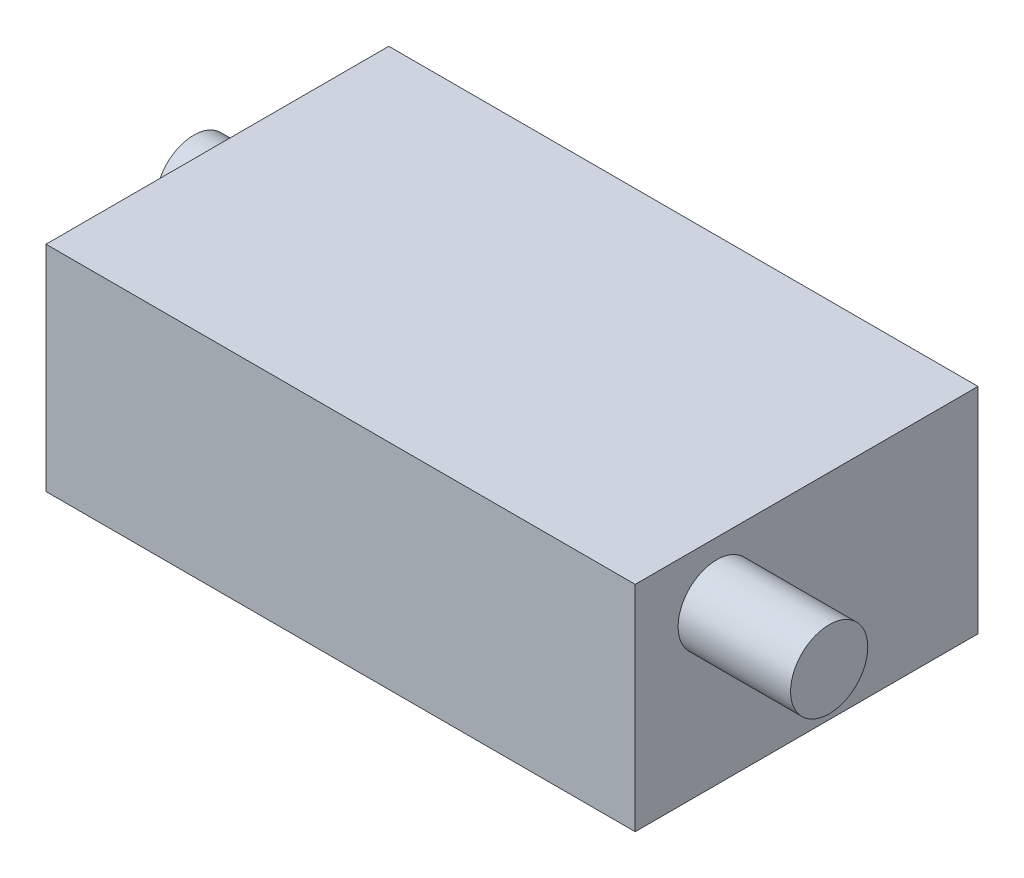
ISO-10303-21;
HEADER;
FILE_DESCRIPTION(('STEP AP214'),'2;1');
FILE_NAME('part.step','',(''),(''),'','','');
FILE_SCHEMA(('AUTOMOTIVE_DESIGN { 1 0 10303 214 1 1 1 1 }'));
ENDSEC;
DATA;
#1=APPLICATION_CONTEXT('core data for automotive mechanical design processes');
#2=APPLICATION_PROTOCOL_DEFINITION('international standard','automotive_design',2000,#1);
#3=PRODUCT_CONTEXT('',#1,'mechanical');
#4=PRODUCT('Part','Part','',(#3));
#5=PRODUCT_RELATED_PRODUCT_CATEGORY('part','',(#4));
#6=PRODUCT_DEFINITION_FORMATION('','',#4);
#7=PRODUCT_DEFINITION_CONTEXT('part definition',#1,'design');
#8=PRODUCT_DEFINITION('design','',#6,#7);
#9=PRODUCT_DEFINITION_SHAPE('','',#8);
#10=(LENGTH_UNIT() NAMED_UNIT(*) SI_UNIT(.MILLI.,.METRE.));
#11=(NAMED_UNIT(*) PLANE_ANGLE_UNIT() SI_UNIT($,.RADIAN.));
#12=(NAMED_UNIT(*) SI_UNIT($,.STERADIAN.) SOLID_ANGLE_UNIT());
#13=UNCERTAINTY_MEASURE_WITH_UNIT(LENGTH_MEASURE(1.E-05),#10,'distance_accuracy_value','');
#14=(GEOMETRIC_REPRESENTATION_CONTEXT(3) GLOBAL_UNCERTAINTY_ASSIGNED_CONTEXT((#13)) GLOBAL_UNIT_ASSIGNED_CONTEXT((#10,
#11,#12)) REPRESENTATION_CONTEXT('',''));
#15=CARTESIAN_POINT('',(0.,0.,0.));
#16=DIRECTION('',(0.,0.,1.));
#17=DIRECTION('',(1.,0.,0.));
#18=AXIS2_PLACEMENT_3D('',#15,#16,#17);
#19=CARTESIAN_POINT('',(104.775,38.1,0.));
#20=DIRECTION('',(-1.,0.,0.));
#21=DIRECTION('',(0.,0.,1.));
#22=AXIS2_PLACEMENT_3D('',#19,#20,#21);
#23=PLANE('',#22);
#24=DIRECTION('',(0.,-1.,0.));
#25=VECTOR('',#24,1.);
#26=CARTESIAN_POINT('',(104.775,0.,0.));
#27=LINE('',#26,#25);
#28=CARTESIAN_POINT('',(104.775,38.1,0.));
#29=VERTEX_POINT('',#28);
#30=CARTESIAN_POINT('',(104.775,0.,0.));
#31=VERTEX_POINT('',#30);
#32=EDGE_CURVE('E85',#29,#31,#27,.T.);
#33=ORIENTED_EDGE('',*,*,#32,.T.);
#34=DIRECTION('',(0.,0.,-1.));
#35=VECTOR('',#34,1.);
#36=CARTESIAN_POINT('',(104.775,0.,0.));
#37=LINE('',#36,#35);
#38=CARTESIAN_POINT('',(104.775,0.,-60.96));
#39=VERTEX_POINT('',#38);
#40=EDGE_CURVE('E80',#31,#39,#37,.T.);
#41=ORIENTED_EDGE('',*,*,#40,.T.);
#42=DIRECTION('',(0.,1.,0.));
#43=VECTOR('',#42,1.);
#44=CARTESIAN_POINT('',(104.775,0.,-60.96));
#45=LINE('',#44,#43);
#46=CARTESIAN_POINT('',(104.775,38.1,-60.96));
#47=VERTEX_POINT('',#46);
#48=EDGE_CURVE('E83',#39,#47,#45,.T.);
#49=ORIENTED_EDGE('',*,*,#48,.T.);
#50=DIRECTION('',(0.,0.,1.));
#51=VECTOR('',#50,1.);
#52=CARTESIAN_POINT('',(104.775,38.1,0.));
#53=LINE('',#52,#51);
#54=EDGE_CURVE('E49',#47,#29,#53,.T.);
#55=ORIENTED_EDGE('',*,*,#54,.T.);
#56=EDGE_LOOP('',(#33,#41,#49,#55));
#57=FACE_BOUND('',#56,.T.);
#58=CARTESIAN_POINT('',(104.775,27.7788489813834,-14.4931277787205));
#59=DIRECTION('',(-1.,0.,0.));
#60=DIRECTION('',(0.,0.,1.));
#61=AXIS2_PLACEMENT_3D('',#58,#59,#60);
#62=CIRCLE('',#61,6.86542550240675);
#63=CARTESIAN_POINT('',(104.775,27.7788489813834,-7.62770227631372));
#64=VERTEX_POINT('',#63);
#65=EDGE_CURVE('E11',#64,#64,#62,.F.);
#66=ORIENTED_EDGE('',*,*,#65,.F.);
#67=EDGE_LOOP('',(#66));
#68=FACE_BOUND('',#67,.T.);
#69=ADVANCED_FACE('F32',(#57,#68),#23,.F.);
#70=CARTESIAN_POINT('',(0.,38.1,0.));
#71=DIRECTION('',(-1.,0.,0.));
#72=DIRECTION('',(0.,0.,1.));
#73=AXIS2_PLACEMENT_3D('',#70,#71,#72);
#74=PLANE('',#73);
#75=DIRECTION('',(0.,-1.,0.));
#76=VECTOR('',#75,1.);
#77=CARTESIAN_POINT('',(0.,0.,0.));
#78=LINE('',#77,#76);
#79=CARTESIAN_POINT('',(0.,38.1,0.));
#80=VERTEX_POINT('',#79);
#81=CARTESIAN_POINT('',(0.,0.,0.));
#82=VERTEX_POINT('',#81);
#83=EDGE_CURVE('E99',#80,#82,#78,.T.);
#84=ORIENTED_EDGE('',*,*,#83,.F.);
#85=DIRECTION('',(0.,0.,1.));
#86=VECTOR('',#85,1.);
#87=CARTESIAN_POINT('',(0.,38.1,0.));
#88=LINE('',#87,#86);
#89=CARTESIAN_POINT('',(0.,38.1,-60.96));
#90=VERTEX_POINT('',#89);
#91=EDGE_CURVE('E72',#90,#80,#88,.T.);
#92=ORIENTED_EDGE('',*,*,#91,.F.);
#93=DIRECTION('',(0.,1.,0.));
#94=VECTOR('',#93,1.);
#95=CARTESIAN_POINT('',(0.,0.,-60.96));
#96=LINE('',#95,#94);
#97=CARTESIAN_POINT('',(0.,0.,-60.96));
#98=VERTEX_POINT('',#97);
#99=EDGE_CURVE('E66',#98,#90,#96,.T.);
#100=ORIENTED_EDGE('',*,*,#99,.F.);
#101=DIRECTION('',(0.,0.,-1.));
#102=VECTOR('',#101,1.);
#103=CARTESIAN_POINT('',(0.,0.,0.));
#104=LINE('',#103,#102);
#105=EDGE_CURVE('E90',#82,#98,#104,.T.);
#106=ORIENTED_EDGE('',*,*,#105,.F.);
#107=EDGE_LOOP('',(#84,#92,#100,#106));
#108=FACE_BOUND('',#107,.T.);
#109=CARTESIAN_POINT('',(0.,15.0277031039288,-46.2809833457989));
#110=DIRECTION('',(-1.,0.,0.));
#111=DIRECTION('',(0.,0.,1.));
#112=AXIS2_PLACEMENT_3D('',#109,#110,#111);
#113=CIRCLE('',#112,6.73289792490981);
#114=CARTESIAN_POINT('',(0.,15.0277031039288,-39.5480854208891));
#115=VERTEX_POINT('',#114);
#116=EDGE_CURVE('E116',#115,#115,#113,.T.);
#117=ORIENTED_EDGE('',*,*,#116,.F.);
#118=EDGE_LOOP('',(#117));
#119=FACE_BOUND('',#118,.T.);
#120=ADVANCED_FACE('F110',(#108,#119),#74,.T.);
#121=CARTESIAN_POINT('',(104.775,0.,0.));
#122=DIRECTION('',(0.,0.,-1.));
#123=DIRECTION('',(-1.,0.,0.));
#124=AXIS2_PLACEMENT_3D('',#121,#122,#123);
#125=PLANE('',#124);
#126=ORIENTED_EDGE('',*,*,#83,.T.);
#127=DIRECTION('',(-1.,0.,0.));
#128=VECTOR('',#127,1.);
#129=CARTESIAN_POINT('',(104.775,0.,0.));
#130=LINE('',#129,#128);
#131=EDGE_CURVE('E41',#31,#82,#130,.T.);
#132=ORIENTED_EDGE('',*,*,#131,.F.);
#133=ORIENTED_EDGE('',*,*,#32,.F.);
#134=DIRECTION('',(-1.,0.,0.));
#135=VECTOR('',#134,1.);
#136=CARTESIAN_POINT('',(104.775,38.1,0.));
#137=LINE('',#136,#135);
#138=EDGE_CURVE('E95',#29,#80,#137,.T.);
#139=ORIENTED_EDGE('',*,*,#138,.T.);
#140=EDGE_LOOP('',(#126,#132,#133,#139));
#141=FACE_BOUND('',#140,.T.);
#142=ADVANCED_FACE('F34',(#141),#125,.F.);
#143=CARTESIAN_POINT('',(104.775,0.,0.));
#144=DIRECTION('',(0.,1.,0.));
#145=DIRECTION('',(0.,0.,1.));
#146=AXIS2_PLACEMENT_3D('',#143,#144,#145);
#147=PLANE('',#146);
#148=ORIENTED_EDGE('',*,*,#105,.T.);
#149=DIRECTION('',(-1.,0.,0.));
#150=VECTOR('',#149,1.);
#151=CARTESIAN_POINT('',(104.775,0.,-60.96));
#152=LINE('',#151,#150);
#153=EDGE_CURVE('E88',#39,#98,#152,.T.);
#154=ORIENTED_EDGE('',*,*,#153,.F.);
#155=ORIENTED_EDGE('',*,*,#40,.F.);
#156=ORIENTED_EDGE('',*,*,#131,.T.);
#157=EDGE_LOOP('',(#148,#154,#155,#156));
#158=FACE_BOUND('',#157,.T.);
#159=ADVANCED_FACE('F89',(#158),#147,.F.);
#160=CARTESIAN_POINT('',(104.775,0.,-60.96));
#161=DIRECTION('',(0.,0.,1.));
#162=DIRECTION('',(1.,0.,0.));
#163=AXIS2_PLACEMENT_3D('',#160,#161,#162);
#164=PLANE('',#163);
#165=ORIENTED_EDGE('',*,*,#99,.T.);
#166=DIRECTION('',(-1.,0.,0.));
#167=VECTOR('',#166,1.);
#168=CARTESIAN_POINT('',(104.775,38.1,-60.96));
#169=LINE('',#168,#167);
#170=EDGE_CURVE('E91',#47,#90,#169,.T.);
#171=ORIENTED_EDGE('',*,*,#170,.F.);
#172=ORIENTED_EDGE('',*,*,#48,.F.);
#173=ORIENTED_EDGE('',*,*,#153,.T.);
#174=EDGE_LOOP('',(#165,#171,#172,#173));
#175=FACE_BOUND('',#174,.T.);
#176=ADVANCED_FACE('F93',(#175),#164,.F.);
#177=CARTESIAN_POINT('',(104.775,38.1,0.));
#178=DIRECTION('',(0.,-1.,0.));
#179=DIRECTION('',(0.,0.,-1.));
#180=AXIS2_PLACEMENT_3D('',#177,#178,#179);
#181=PLANE('',#180);
#182=ORIENTED_EDGE('',*,*,#91,.T.);
#183=ORIENTED_EDGE('',*,*,#138,.F.);
#184=ORIENTED_EDGE('',*,*,#54,.F.);
#185=ORIENTED_EDGE('',*,*,#170,.T.);
#186=EDGE_LOOP('',(#182,#183,#184,#185));
#187=FACE_BOUND('',#186,.T.);
#188=ADVANCED_FACE('F142',(#187),#181,.F.);
#189=CARTESIAN_POINT('',(-20.0025,15.0277031039288,-46.2809833457989));
#190=DIRECTION('',(1.,0.,0.));
#191=DIRECTION('',(0.,0.,-1.));
#192=AXIS2_PLACEMENT_3D('',#189,#190,#191);
#193=CYLINDRICAL_SURFACE('',#192,6.73289792490981);
#194=CARTESIAN_POINT('',(-20.0025,15.0277031039288,-46.2809833457989));
#195=DIRECTION('',(-1.,0.,0.));
#196=DIRECTION('',(0.,0.,1.));
#197=AXIS2_PLACEMENT_3D('',#194,#195,#196);
#198=CIRCLE('',#197,6.73289792490981);
#199=CARTESIAN_POINT('',(-20.0025,15.0277031039288,-39.5480854208891));
#200=VERTEX_POINT('',#199);
#201=EDGE_CURVE('E102',#200,#200,#198,.T.);
#202=ORIENTED_EDGE('',*,*,#201,.F.);
#203=EDGE_LOOP('',(#202));
#204=FACE_BOUND('',#203,.T.);
#205=ORIENTED_EDGE('',*,*,#116,.T.);
#206=EDGE_LOOP('',(#205));
#207=FACE_BOUND('',#206,.T.);
#208=ADVANCED_FACE('F139',(#204,#207),#193,.T.);
#209=CARTESIAN_POINT('',(-20.0025,15.0277031039288,-46.2809833457989));
#210=DIRECTION('',(-1.,0.,0.));
#211=DIRECTION('',(0.,0.,1.));
#212=AXIS2_PLACEMENT_3D('',#209,#210,#211);
#213=PLANE('',#212);
#214=ORIENTED_EDGE('',*,*,#201,.T.);
#215=EDGE_LOOP('',(#214));
#216=FACE_BOUND('',#215,.T.);
#217=ADVANCED_FACE('F131',(#216),#213,.T.);
#218=CARTESIAN_POINT('',(124.7775,27.7788489813834,-14.4931277787205));
#219=DIRECTION('',(-1.,0.,0.));
#220=DIRECTION('',(0.,0.,1.));
#221=AXIS2_PLACEMENT_3D('',#218,#219,#220);
#222=CYLINDRICAL_SURFACE('',#221,6.86542550240675);
#223=CARTESIAN_POINT('',(124.7775,27.7788489813834,-14.4931277787205));
#224=DIRECTION('',(1.,0.,0.));
#225=DIRECTION('',(0.,0.,-1.));
#226=AXIS2_PLACEMENT_3D('',#223,#224,#225);
#227=CIRCLE('',#226,6.86542550240675);
#228=CARTESIAN_POINT('',(124.7775,27.7788489813834,-21.3585532811272));
#229=VERTEX_POINT('',#228);
#230=EDGE_CURVE('E118',#229,#229,#227,.T.);
#231=ORIENTED_EDGE('',*,*,#230,.F.);
#232=EDGE_LOOP('',(#231));
#233=FACE_BOUND('',#232,.T.);
#234=ORIENTED_EDGE('',*,*,#65,.T.);
#235=EDGE_LOOP('',(#234));
#236=FACE_BOUND('',#235,.T.);
#237=ADVANCED_FACE('F128',(#233,#236),#222,.T.);
#238=CARTESIAN_POINT('',(124.7775,27.7788489813834,-14.4931277787205));
#239=DIRECTION('',(1.,0.,0.));
#240=DIRECTION('',(0.,0.,-1.));
#241=AXIS2_PLACEMENT_3D('',#238,#239,#240);
#242=PLANE('',#241);
#243=ORIENTED_EDGE('',*,*,#230,.T.);
#244=EDGE_LOOP('',(#243));
#245=FACE_BOUND('',#244,.T.);
#246=ADVANCED_FACE('F126',(#245),#242,.T.);
#247=CLOSED_SHELL('',(#69,#120,#142,#159,#176,#188,#208,#217,#237,#246));
#248=MANIFOLD_SOLID_BREP('B2',#247);
#249=ADVANCED_BREP_SHAPE_REPRESENTATION('',(#18,#248),#14);
#250=SHAPE_DEFINITION_REPRESENTATION(#9,#249);
ENDSEC;
END-ISO-10303-21;
